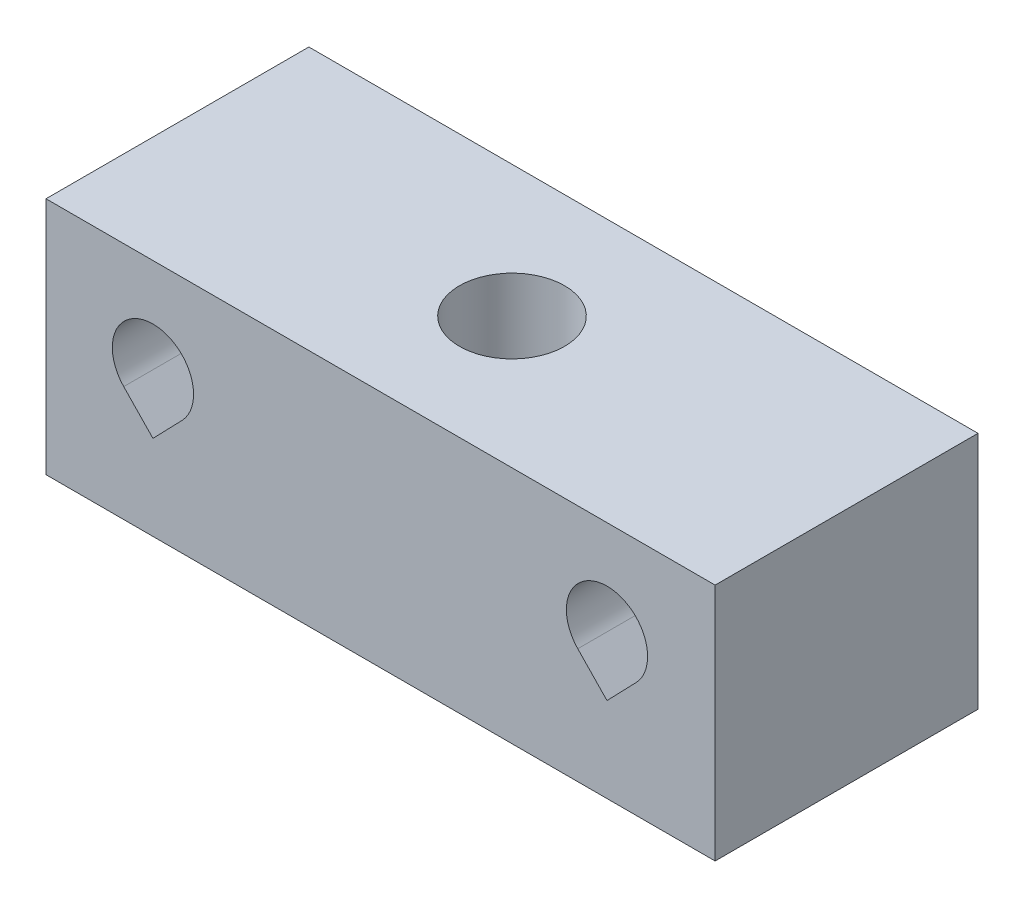
ISO-10303-21;
HEADER;
FILE_DESCRIPTION(('STEP AP214'),'2;1');
FILE_NAME('part.step','',(''),(''),'','','');
FILE_SCHEMA(('AUTOMOTIVE_DESIGN { 1 0 10303 214 1 1 1 1 }'));
ENDSEC;
DATA;
#1=APPLICATION_CONTEXT('core data for automotive mechanical design processes');
#2=APPLICATION_PROTOCOL_DEFINITION('international standard','automotive_design',2000,#1);
#3=PRODUCT_CONTEXT('',#1,'mechanical');
#4=PRODUCT('Part','Part','',(#3));
#5=PRODUCT_RELATED_PRODUCT_CATEGORY('part','',(#4));
#6=PRODUCT_DEFINITION_FORMATION('','',#4);
#7=PRODUCT_DEFINITION_CONTEXT('part definition',#1,'design');
#8=PRODUCT_DEFINITION('design','',#6,#7);
#9=PRODUCT_DEFINITION_SHAPE('','',#8);
#10=(LENGTH_UNIT() NAMED_UNIT(*) SI_UNIT(.MILLI.,.METRE.));
#11=(NAMED_UNIT(*) PLANE_ANGLE_UNIT() SI_UNIT($,.RADIAN.));
#12=(NAMED_UNIT(*) SI_UNIT($,.STERADIAN.) SOLID_ANGLE_UNIT());
#13=UNCERTAINTY_MEASURE_WITH_UNIT(LENGTH_MEASURE(1.E-05),#10,'distance_accuracy_value','');
#14=(GEOMETRIC_REPRESENTATION_CONTEXT(3) GLOBAL_UNCERTAINTY_ASSIGNED_CONTEXT((#13)) GLOBAL_UNIT_ASSIGNED_CONTEXT((#10,
#11,#12)) REPRESENTATION_CONTEXT('',''));
#15=CARTESIAN_POINT('',(0.,0.,0.));
#16=DIRECTION('',(0.,0.,1.));
#17=DIRECTION('',(1.,0.,0.));
#18=AXIS2_PLACEMENT_3D('',#15,#16,#17);
#19=CARTESIAN_POINT('',(11.95,-36.,11.));
#20=DIRECTION('',(-1.,0.,0.));
#21=DIRECTION('',(0.,0.,1.));
#22=AXIS2_PLACEMENT_3D('',#19,#20,#21);
#23=PLANE('',#22);
#24=DIRECTION('',(0.,0.,-1.));
#25=VECTOR('',#24,1.);
#26=CARTESIAN_POINT('',(11.95,-46.,11.));
#27=LINE('',#26,#25);
#28=CARTESIAN_POINT('',(11.95,-46.,11.));
#29=VERTEX_POINT('',#28);
#30=CARTESIAN_POINT('',(11.95,-46.,0.));
#31=VERTEX_POINT('',#30);
#32=EDGE_CURVE('E157',#29,#31,#27,.T.);
#33=ORIENTED_EDGE('',*,*,#32,.F.);
#34=DIRECTION('',(0.,-1.,0.));
#35=VECTOR('',#34,1.);
#36=CARTESIAN_POINT('',(11.95,-36.,11.));
#37=LINE('',#36,#35);
#38=CARTESIAN_POINT('',(11.95,-36.,11.));
#39=VERTEX_POINT('',#38);
#40=EDGE_CURVE('E11',#39,#29,#37,.T.);
#41=ORIENTED_EDGE('',*,*,#40,.F.);
#42=DIRECTION('',(0.,0.,-1.));
#43=VECTOR('',#42,1.);
#44=CARTESIAN_POINT('',(11.95,-36.,11.));
#45=LINE('',#44,#43);
#46=CARTESIAN_POINT('',(11.95,-36.,0.));
#47=VERTEX_POINT('',#46);
#48=EDGE_CURVE('E162',#39,#47,#45,.T.);
#49=ORIENTED_EDGE('',*,*,#48,.T.);
#50=DIRECTION('',(0.,-1.,0.));
#51=VECTOR('',#50,1.);
#52=CARTESIAN_POINT('',(11.95,-36.,0.));
#53=LINE('',#52,#51);
#54=EDGE_CURVE('E33',#47,#31,#53,.T.);
#55=ORIENTED_EDGE('',*,*,#54,.T.);
#56=EDGE_LOOP('',(#33,#41,#49,#55));
#57=FACE_BOUND('',#56,.T.);
#58=ADVANCED_FACE('F30',(#57),#23,.T.);
#59=CARTESIAN_POINT('',(39.95,-36.,11.));
#60=DIRECTION('',(0.,0.,1.));
#61=DIRECTION('',(1.,0.,0.));
#62=AXIS2_PLACEMENT_3D('',#59,#60,#61);
#63=PLANE('',#62);
#64=CARTESIAN_POINT('',(16.425,-40.,11.));
#65=DIRECTION('',(0.,0.,-1.));
#66=DIRECTION('',(-1.,0.,0.));
#67=AXIS2_PLACEMENT_3D('',#64,#65,#66);
#68=CIRCLE('',#67,1.7);
#69=CARTESIAN_POINT('',(15.2021223394243,-41.1809192297803,11.));
#70=VERTEX_POINT('',#69);
#71=CARTESIAN_POINT('',(17.6478776605757,-41.1809192297803,11.));
#72=VERTEX_POINT('',#71);
#73=EDGE_CURVE('E109',#70,#72,#68,.T.);
#74=ORIENTED_EDGE('',*,*,#73,.T.);
#75=DIRECTION('',(-0.694658370458997,-0.719339800338651,0.));
#76=VECTOR('',#75,1.);
#77=CARTESIAN_POINT('',(17.6478776605757,-41.1809192297803,11.));
#78=LINE('',#77,#76);
#79=CARTESIAN_POINT('',(16.425,-42.4472461173637,11.));
#80=VERTEX_POINT('',#79);
#81=EDGE_CURVE('E116',#72,#80,#78,.T.);
#82=ORIENTED_EDGE('',*,*,#81,.T.);
#83=DIRECTION('',(-0.694658370458996,0.719339800338652,0.));
#84=VECTOR('',#83,1.);
#85=CARTESIAN_POINT('',(16.425,-42.4472461173637,11.));
#86=LINE('',#85,#84);
#87=EDGE_CURVE('E46',#80,#70,#86,.T.);
#88=ORIENTED_EDGE('',*,*,#87,.T.);
#89=EDGE_LOOP('',(#74,#82,#88));
#90=FACE_BOUND('',#89,.T.);
#91=DIRECTION('',(0.694658370458997,-0.719339800338651,0.));
#92=VECTOR('',#91,1.);
#93=CARTESIAN_POINT('',(34.2021223394243,-41.1809192297803,11.));
#94=LINE('',#93,#92);
#95=CARTESIAN_POINT('',(34.2021223394243,-41.1809192297803,11.));
#96=VERTEX_POINT('',#95);
#97=CARTESIAN_POINT('',(35.425,-42.4472461173637,11.));
#98=VERTEX_POINT('',#97);
#99=EDGE_CURVE('E136',#96,#98,#94,.T.);
#100=ORIENTED_EDGE('',*,*,#99,.F.);
#101=CARTESIAN_POINT('',(35.425,-40.,11.));
#102=DIRECTION('',(0.,0.,1.));
#103=DIRECTION('',(1.,0.,0.));
#104=AXIS2_PLACEMENT_3D('',#101,#102,#103);
#105=CIRCLE('',#104,1.7);
#106=CARTESIAN_POINT('',(36.6478776605757,-41.1809192297803,11.));
#107=VERTEX_POINT('',#106);
#108=EDGE_CURVE('E142',#107,#96,#105,.T.);
#109=ORIENTED_EDGE('',*,*,#108,.F.);
#110=DIRECTION('',(0.694658370458997,0.719339800338651,0.));
#111=VECTOR('',#110,1.);
#112=CARTESIAN_POINT('',(35.425,-42.4472461173637,11.));
#113=LINE('',#112,#111);
#114=EDGE_CURVE('E150',#98,#107,#113,.T.);
#115=ORIENTED_EDGE('',*,*,#114,.F.);
#116=EDGE_LOOP('',(#100,#109,#115));
#117=FACE_BOUND('',#116,.T.);
#118=DIRECTION('',(-1.,0.,0.));
#119=VECTOR('',#118,1.);
#120=CARTESIAN_POINT('',(39.95,-46.,11.));
#121=LINE('',#120,#119);
#122=CARTESIAN_POINT('',(39.95,-46.,11.));
#123=VERTEX_POINT('',#122);
#124=EDGE_CURVE('E166',#123,#29,#121,.T.);
#125=ORIENTED_EDGE('',*,*,#124,.F.);
#126=DIRECTION('',(0.,-1.,0.));
#127=VECTOR('',#126,1.);
#128=CARTESIAN_POINT('',(39.95,-36.,11.));
#129=LINE('',#128,#127);
#130=CARTESIAN_POINT('',(39.95,-36.,11.));
#131=VERTEX_POINT('',#130);
#132=EDGE_CURVE('E38',#131,#123,#129,.T.);
#133=ORIENTED_EDGE('',*,*,#132,.F.);
#134=DIRECTION('',(-1.,0.,0.));
#135=VECTOR('',#134,1.);
#136=CARTESIAN_POINT('',(39.95,-36.,11.));
#137=LINE('',#136,#135);
#138=EDGE_CURVE('E172',#131,#39,#137,.T.);
#139=ORIENTED_EDGE('',*,*,#138,.T.);
#140=ORIENTED_EDGE('',*,*,#40,.T.);
#141=EDGE_LOOP('',(#125,#133,#139,#140));
#142=FACE_BOUND('',#141,.T.);
#143=ADVANCED_FACE('F120',(#90,#117,#142),#63,.T.);
#144=CARTESIAN_POINT('',(39.95,-36.,0.));
#145=DIRECTION('',(1.,0.,0.));
#146=DIRECTION('',(0.,0.,-1.));
#147=AXIS2_PLACEMENT_3D('',#144,#145,#146);
#148=PLANE('',#147);
#149=DIRECTION('',(0.,0.,1.));
#150=VECTOR('',#149,1.);
#151=CARTESIAN_POINT('',(39.95,-46.,0.));
#152=LINE('',#151,#150);
#153=CARTESIAN_POINT('',(39.95,-46.,0.));
#154=VERTEX_POINT('',#153);
#155=EDGE_CURVE('E180',#154,#123,#152,.T.);
#156=ORIENTED_EDGE('',*,*,#155,.F.);
#157=DIRECTION('',(0.,-1.,0.));
#158=VECTOR('',#157,1.);
#159=CARTESIAN_POINT('',(39.95,-36.,0.));
#160=LINE('',#159,#158);
#161=CARTESIAN_POINT('',(39.95,-36.,0.));
#162=VERTEX_POINT('',#161);
#163=EDGE_CURVE('E185',#162,#154,#160,.T.);
#164=ORIENTED_EDGE('',*,*,#163,.F.);
#165=DIRECTION('',(0.,0.,1.));
#166=VECTOR('',#165,1.);
#167=CARTESIAN_POINT('',(39.95,-36.,0.));
#168=LINE('',#167,#166);
#169=EDGE_CURVE('E169',#162,#131,#168,.T.);
#170=ORIENTED_EDGE('',*,*,#169,.T.);
#171=ORIENTED_EDGE('',*,*,#132,.T.);
#172=EDGE_LOOP('',(#156,#164,#170,#171));
#173=FACE_BOUND('',#172,.T.);
#174=ADVANCED_FACE('F203',(#173),#148,.T.);
#175=CARTESIAN_POINT('',(11.95,-36.,0.));
#176=DIRECTION('',(0.,0.,-1.));
#177=DIRECTION('',(-1.,0.,0.));
#178=AXIS2_PLACEMENT_3D('',#175,#176,#177);
#179=PLANE('',#178);
#180=CARTESIAN_POINT('',(16.425,-40.,0.));
#181=DIRECTION('',(0.,0.,-1.));
#182=DIRECTION('',(-1.,0.,0.));
#183=AXIS2_PLACEMENT_3D('',#180,#181,#182);
#184=CIRCLE('',#183,1.7);
#185=CARTESIAN_POINT('',(15.2021223394243,-41.1809192297803,0.));
#186=VERTEX_POINT('',#185);
#187=CARTESIAN_POINT('',(17.6478776605757,-41.1809192297803,0.));
#188=VERTEX_POINT('',#187);
#189=EDGE_CURVE('E54',#186,#188,#184,.T.);
#190=ORIENTED_EDGE('',*,*,#189,.F.);
#191=DIRECTION('',(-0.694658370458996,0.719339800338652,0.));
#192=VECTOR('',#191,1.);
#193=CARTESIAN_POINT('',(16.425,-42.4472461173637,0.));
#194=LINE('',#193,#192);
#195=CARTESIAN_POINT('',(16.425,-42.4472461173637,0.));
#196=VERTEX_POINT('',#195);
#197=EDGE_CURVE('E122',#196,#186,#194,.T.);
#198=ORIENTED_EDGE('',*,*,#197,.F.);
#199=DIRECTION('',(-0.694658370458997,-0.719339800338651,0.));
#200=VECTOR('',#199,1.);
#201=CARTESIAN_POINT('',(17.6478776605757,-41.1809192297803,0.));
#202=LINE('',#201,#200);
#203=EDGE_CURVE('E125',#188,#196,#202,.T.);
#204=ORIENTED_EDGE('',*,*,#203,.F.);
#205=EDGE_LOOP('',(#190,#198,#204));
#206=FACE_BOUND('',#205,.T.);
#207=DIRECTION('',(0.694658370458997,-0.719339800338651,0.));
#208=VECTOR('',#207,1.);
#209=CARTESIAN_POINT('',(34.2021223394243,-41.1809192297803,0.));
#210=LINE('',#209,#208);
#211=CARTESIAN_POINT('',(34.2021223394243,-41.1809192297803,0.));
#212=VERTEX_POINT('',#211);
#213=CARTESIAN_POINT('',(35.425,-42.4472461173637,0.));
#214=VERTEX_POINT('',#213);
#215=EDGE_CURVE('E138',#212,#214,#210,.T.);
#216=ORIENTED_EDGE('',*,*,#215,.T.);
#217=DIRECTION('',(0.694658370458997,0.719339800338651,0.));
#218=VECTOR('',#217,1.);
#219=CARTESIAN_POINT('',(35.425,-42.4472461173637,0.));
#220=LINE('',#219,#218);
#221=CARTESIAN_POINT('',(36.6478776605757,-41.1809192297803,0.));
#222=VERTEX_POINT('',#221);
#223=EDGE_CURVE('E141',#214,#222,#220,.T.);
#224=ORIENTED_EDGE('',*,*,#223,.T.);
#225=CARTESIAN_POINT('',(35.425,-40.,0.));
#226=DIRECTION('',(0.,0.,1.));
#227=DIRECTION('',(1.,0.,0.));
#228=AXIS2_PLACEMENT_3D('',#225,#226,#227);
#229=CIRCLE('',#228,1.7);
#230=EDGE_CURVE('E145',#222,#212,#229,.T.);
#231=ORIENTED_EDGE('',*,*,#230,.T.);
#232=EDGE_LOOP('',(#216,#224,#231));
#233=FACE_BOUND('',#232,.T.);
#234=DIRECTION('',(1.,0.,0.));
#235=VECTOR('',#234,1.);
#236=CARTESIAN_POINT('',(11.95,-46.,0.));
#237=LINE('',#236,#235);
#238=EDGE_CURVE('E177',#31,#154,#237,.T.);
#239=ORIENTED_EDGE('',*,*,#238,.F.);
#240=ORIENTED_EDGE('',*,*,#54,.F.);
#241=DIRECTION('',(1.,0.,0.));
#242=VECTOR('',#241,1.);
#243=CARTESIAN_POINT('',(11.95,-36.,0.));
#244=LINE('',#243,#242);
#245=EDGE_CURVE('E165',#47,#162,#244,.T.);
#246=ORIENTED_EDGE('',*,*,#245,.T.);
#247=ORIENTED_EDGE('',*,*,#163,.T.);
#248=EDGE_LOOP('',(#239,#240,#246,#247));
#249=FACE_BOUND('',#248,.T.);
#250=ADVANCED_FACE('F193',(#206,#233,#249),#179,.T.);
#251=CARTESIAN_POINT('',(11.95,-36.,0.));
#252=DIRECTION('',(0.,-1.,0.));
#253=DIRECTION('',(0.,0.,-1.));
#254=AXIS2_PLACEMENT_3D('',#251,#252,#253);
#255=PLANE('',#254);
#256=CARTESIAN_POINT('',(25.95,-36.,5.5));
#257=DIRECTION('',(0.,-1.,0.));
#258=DIRECTION('',(0.,0.,-1.));
#259=AXIS2_PLACEMENT_3D('',#256,#257,#258);
#260=CIRCLE('',#259,2.20000000000001);
#261=CARTESIAN_POINT('',(25.95,-36.,3.29999999999999));
#262=VERTEX_POINT('',#261);
#263=EDGE_CURVE('E128',#262,#262,#260,.T.);
#264=ORIENTED_EDGE('',*,*,#263,.T.);
#265=EDGE_LOOP('',(#264));
#266=FACE_BOUND('',#265,.T.);
#267=ORIENTED_EDGE('',*,*,#48,.F.);
#268=ORIENTED_EDGE('',*,*,#138,.F.);
#269=ORIENTED_EDGE('',*,*,#169,.F.);
#270=ORIENTED_EDGE('',*,*,#245,.F.);
#271=EDGE_LOOP('',(#267,#268,#269,#270));
#272=FACE_BOUND('',#271,.T.);
#273=ADVANCED_FACE('F200',(#266,#272),#255,.F.);
#274=CARTESIAN_POINT('',(11.95,-46.,0.));
#275=DIRECTION('',(0.,-1.,0.));
#276=DIRECTION('',(0.,0.,-1.));
#277=AXIS2_PLACEMENT_3D('',#274,#275,#276);
#278=PLANE('',#277);
#279=CARTESIAN_POINT('',(25.95,-46.,5.5));
#280=DIRECTION('',(0.,-1.,0.));
#281=DIRECTION('',(0.,0.,-1.));
#282=AXIS2_PLACEMENT_3D('',#279,#280,#281);
#283=CIRCLE('',#282,2.20000000000001);
#284=CARTESIAN_POINT('',(25.95,-46.,3.29999999999999));
#285=VERTEX_POINT('',#284);
#286=EDGE_CURVE('E328',#285,#285,#283,.T.);
#287=ORIENTED_EDGE('',*,*,#286,.F.);
#288=EDGE_LOOP('',(#287));
#289=FACE_BOUND('',#288,.T.);
#290=ORIENTED_EDGE('',*,*,#32,.T.);
#291=ORIENTED_EDGE('',*,*,#238,.T.);
#292=ORIENTED_EDGE('',*,*,#155,.T.);
#293=ORIENTED_EDGE('',*,*,#124,.T.);
#294=EDGE_LOOP('',(#290,#291,#292,#293));
#295=FACE_BOUND('',#294,.T.);
#296=ADVANCED_FACE('F195',(#289,#295),#278,.T.);
#297=CARTESIAN_POINT('',(34.2021223394243,-41.1809192297803,0.));
#298=DIRECTION('',(-0.719339800338651,-0.694658370458997,0.));
#299=DIRECTION('',(0.694658370458997,-0.719339800338651,0.));
#300=AXIS2_PLACEMENT_3D('',#297,#298,#299);
#301=PLANE('',#300);
#302=ORIENTED_EDGE('',*,*,#99,.T.);
#303=DIRECTION('',(0.,0.,1.));
#304=VECTOR('',#303,1.);
#305=CARTESIAN_POINT('',(35.425,-42.4472461173637,0.));
#306=LINE('',#305,#304);
#307=EDGE_CURVE('E148',#214,#98,#306,.T.);
#308=ORIENTED_EDGE('',*,*,#307,.F.);
#309=ORIENTED_EDGE('',*,*,#215,.F.);
#310=DIRECTION('',(0.,0.,1.));
#311=VECTOR('',#310,1.);
#312=CARTESIAN_POINT('',(34.2021223394243,-41.1809192297803,0.));
#313=LINE('',#312,#311);
#314=EDGE_CURVE('E155',#212,#96,#313,.T.);
#315=ORIENTED_EDGE('',*,*,#314,.T.);
#316=EDGE_LOOP('',(#302,#308,#309,#315));
#317=FACE_BOUND('',#316,.T.);
#318=ADVANCED_FACE('F278',(#317),#301,.F.);
#319=CARTESIAN_POINT('',(35.425,-40.,0.));
#320=DIRECTION('',(0.,0.,1.));
#321=DIRECTION('',(1.,0.,0.));
#322=AXIS2_PLACEMENT_3D('',#319,#320,#321);
#323=CYLINDRICAL_SURFACE('',#322,1.7);
#324=ORIENTED_EDGE('',*,*,#108,.T.);
#325=ORIENTED_EDGE('',*,*,#314,.F.);
#326=ORIENTED_EDGE('',*,*,#230,.F.);
#327=DIRECTION('',(0.,0.,1.));
#328=VECTOR('',#327,1.);
#329=CARTESIAN_POINT('',(36.6478776605757,-41.1809192297803,0.));
#330=LINE('',#329,#328);
#331=EDGE_CURVE('E158',#222,#107,#330,.T.);
#332=ORIENTED_EDGE('',*,*,#331,.T.);
#333=EDGE_LOOP('',(#324,#325,#326,#332));
#334=FACE_BOUND('',#333,.T.);
#335=ADVANCED_FACE('F295',(#334),#323,.F.);
#336=CARTESIAN_POINT('',(35.425,-42.4472461173637,0.));
#337=DIRECTION('',(0.719339800338651,-0.694658370458997,0.));
#338=DIRECTION('',(0.694658370458997,0.719339800338651,0.));
#339=AXIS2_PLACEMENT_3D('',#336,#337,#338);
#340=PLANE('',#339);
#341=ORIENTED_EDGE('',*,*,#114,.T.);
#342=ORIENTED_EDGE('',*,*,#331,.F.);
#343=ORIENTED_EDGE('',*,*,#223,.F.);
#344=ORIENTED_EDGE('',*,*,#307,.T.);
#345=EDGE_LOOP('',(#341,#342,#343,#344));
#346=FACE_BOUND('',#345,.T.);
#347=ADVANCED_FACE('F226',(#346),#340,.F.);
#348=CARTESIAN_POINT('',(16.425,-40.,11.));
#349=DIRECTION('',(0.,0.,-1.));
#350=DIRECTION('',(-1.,0.,0.));
#351=AXIS2_PLACEMENT_3D('',#348,#349,#350);
#352=CYLINDRICAL_SURFACE('',#351,1.7);
#353=ORIENTED_EDGE('',*,*,#189,.T.);
#354=DIRECTION('',(0.,0.,-1.));
#355=VECTOR('',#354,1.);
#356=CARTESIAN_POINT('',(17.6478776605757,-41.1809192297803,11.));
#357=LINE('',#356,#355);
#358=EDGE_CURVE('E105',#72,#188,#357,.T.);
#359=ORIENTED_EDGE('',*,*,#358,.F.);
#360=ORIENTED_EDGE('',*,*,#73,.F.);
#361=DIRECTION('',(0.,0.,-1.));
#362=VECTOR('',#361,1.);
#363=CARTESIAN_POINT('',(15.2021223394243,-41.1809192297803,11.));
#364=LINE('',#363,#362);
#365=EDGE_CURVE('E134',#70,#186,#364,.T.);
#366=ORIENTED_EDGE('',*,*,#365,.T.);
#367=EDGE_LOOP('',(#353,#359,#360,#366));
#368=FACE_BOUND('',#367,.T.);
#369=ADVANCED_FACE('F107',(#368),#352,.F.);
#370=CARTESIAN_POINT('',(16.425,-42.4472461173637,11.));
#371=DIRECTION('',(-0.719339800338652,-0.694658370458996,0.));
#372=DIRECTION('',(0.694658370458996,-0.719339800338652,0.));
#373=AXIS2_PLACEMENT_3D('',#370,#371,#372);
#374=PLANE('',#373);
#375=ORIENTED_EDGE('',*,*,#197,.T.);
#376=ORIENTED_EDGE('',*,*,#365,.F.);
#377=ORIENTED_EDGE('',*,*,#87,.F.);
#378=DIRECTION('',(0.,0.,-1.));
#379=VECTOR('',#378,1.);
#380=CARTESIAN_POINT('',(16.425,-42.4472461173637,11.));
#381=LINE('',#380,#379);
#382=EDGE_CURVE('E113',#80,#196,#381,.T.);
#383=ORIENTED_EDGE('',*,*,#382,.T.);
#384=EDGE_LOOP('',(#375,#376,#377,#383));
#385=FACE_BOUND('',#384,.T.);
#386=ADVANCED_FACE('F243',(#385),#374,.F.);
#387=CARTESIAN_POINT('',(17.6478776605757,-41.1809192297803,11.));
#388=DIRECTION('',(0.719339800338651,-0.694658370458997,0.));
#389=DIRECTION('',(0.694658370458997,0.719339800338651,0.));
#390=AXIS2_PLACEMENT_3D('',#387,#388,#389);
#391=PLANE('',#390);
#392=ORIENTED_EDGE('',*,*,#203,.T.);
#393=ORIENTED_EDGE('',*,*,#382,.F.);
#394=ORIENTED_EDGE('',*,*,#81,.F.);
#395=ORIENTED_EDGE('',*,*,#358,.T.);
#396=EDGE_LOOP('',(#392,#393,#394,#395));
#397=FACE_BOUND('',#396,.T.);
#398=ADVANCED_FACE('F117',(#397),#391,.F.);
#399=CARTESIAN_POINT('',(25.95,-46.,5.5));
#400=DIRECTION('',(0.,-1.,0.));
#401=DIRECTION('',(0.,0.,-1.));
#402=AXIS2_PLACEMENT_3D('',#399,#400,#401);
#403=CYLINDRICAL_SURFACE('',#402,2.20000000000001);
#404=ORIENTED_EDGE('',*,*,#263,.F.);
#405=EDGE_LOOP('',(#404));
#406=FACE_BOUND('',#405,.T.);
#407=ORIENTED_EDGE('',*,*,#286,.T.);
#408=EDGE_LOOP('',(#407));
#409=FACE_BOUND('',#408,.T.);
#410=ADVANCED_FACE('F260',(#406,#409),#403,.F.);
#411=CLOSED_SHELL('',(#58,#143,#174,#250,#273,#296,#318,#335,#347,#369,#386,#398,#410));
#412=MANIFOLD_SOLID_BREP('B2',#411);
#413=ADVANCED_BREP_SHAPE_REPRESENTATION('',(#18,#412),#14);
#414=SHAPE_DEFINITION_REPRESENTATION(#9,#413);
ENDSEC;
END-ISO-10303-21;
